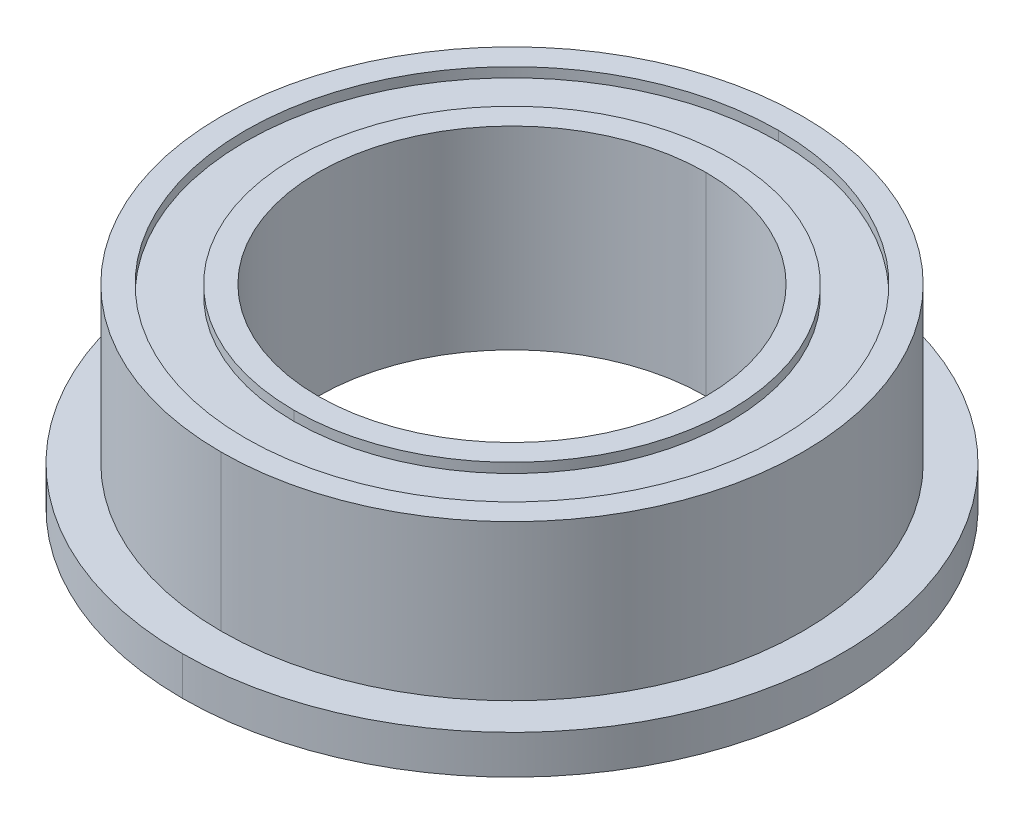
ISO-10303-21;
HEADER;
FILE_DESCRIPTION(('STEP AP214'),'2;1');
FILE_NAME('part.step','',(''),(''),'','','');
FILE_SCHEMA(('AUTOMOTIVE_DESIGN { 1 0 10303 214 1 1 1 1 }'));
ENDSEC;
DATA;
#1=APPLICATION_CONTEXT('core data for automotive mechanical design processes');
#2=APPLICATION_PROTOCOL_DEFINITION('international standard','automotive_design',2000,#1);
#3=PRODUCT_CONTEXT('',#1,'mechanical');
#4=PRODUCT('Part','Part','',(#3));
#5=PRODUCT_RELATED_PRODUCT_CATEGORY('part','',(#4));
#6=PRODUCT_DEFINITION_FORMATION('','',#4);
#7=PRODUCT_DEFINITION_CONTEXT('part definition',#1,'design');
#8=PRODUCT_DEFINITION('design','',#6,#7);
#9=PRODUCT_DEFINITION_SHAPE('','',#8);
#10=(LENGTH_UNIT() NAMED_UNIT(*) SI_UNIT(.MILLI.,.METRE.));
#11=(NAMED_UNIT(*) PLANE_ANGLE_UNIT() SI_UNIT($,.RADIAN.));
#12=(NAMED_UNIT(*) SI_UNIT($,.STERADIAN.) SOLID_ANGLE_UNIT());
#13=UNCERTAINTY_MEASURE_WITH_UNIT(LENGTH_MEASURE(1.E-05),#10,'distance_accuracy_value','');
#14=(GEOMETRIC_REPRESENTATION_CONTEXT(3) GLOBAL_UNCERTAINTY_ASSIGNED_CONTEXT((#13)) GLOBAL_UNIT_ASSIGNED_CONTEXT((#10,
#11,#12)) REPRESENTATION_CONTEXT('',''));
#15=CARTESIAN_POINT('',(0.,0.,0.));
#16=DIRECTION('',(0.,0.,1.));
#17=DIRECTION('',(1.,0.,0.));
#18=AXIS2_PLACEMENT_3D('',#15,#16,#17);
#19=CARTESIAN_POINT('',(0.,0.2,0.));
#20=DIRECTION('',(0.,-1.,0.));
#21=DIRECTION('',(0.,0.,-1.));
#22=AXIS2_PLACEMENT_3D('',#19,#20,#21);
#23=CYLINDRICAL_SURFACE('',#22,4.5);
#24=DIRECTION('',(0.,-1.,0.));
#25=VECTOR('',#24,1.);
#26=CARTESIAN_POINT('',(0.,0.2,4.5));
#27=LINE('',#26,#25);
#28=CARTESIAN_POINT('',(0.,0.2,4.5));
#29=VERTEX_POINT('',#28);
#30=CARTESIAN_POINT('',(0.,0.,4.5));
#31=VERTEX_POINT('',#30);
#32=EDGE_CURVE('E240',#29,#31,#27,.T.);
#33=ORIENTED_EDGE('',*,*,#32,.F.);
#34=CARTESIAN_POINT('',(0.,0.2,0.));
#35=DIRECTION('',(0.,1.,0.));
#36=DIRECTION('',(0.,0.,1.));
#37=AXIS2_PLACEMENT_3D('',#34,#35,#36);
#38=CIRCLE('',#37,4.5);
#39=CARTESIAN_POINT('',(0.,0.2,-4.5));
#40=VERTEX_POINT('',#39);
#41=EDGE_CURVE('E11',#40,#29,#38,.T.);
#42=ORIENTED_EDGE('',*,*,#41,.F.);
#43=DIRECTION('',(0.,-1.,0.));
#44=VECTOR('',#43,1.);
#45=CARTESIAN_POINT('',(0.,0.2,-4.5));
#46=LINE('',#45,#44);
#47=CARTESIAN_POINT('',(0.,0.,-4.5));
#48=VERTEX_POINT('',#47);
#49=EDGE_CURVE('E274',#40,#48,#46,.T.);
#50=ORIENTED_EDGE('',*,*,#49,.T.);
#51=CARTESIAN_POINT('',(0.,0.,0.));
#52=DIRECTION('',(0.,1.,0.));
#53=DIRECTION('',(0.,0.,1.));
#54=AXIS2_PLACEMENT_3D('',#51,#52,#53);
#55=CIRCLE('',#54,4.5);
#56=EDGE_CURVE('E181',#48,#31,#55,.T.);
#57=ORIENTED_EDGE('',*,*,#56,.T.);
#58=EDGE_LOOP('',(#33,#42,#50,#57));
#59=FACE_BOUND('',#58,.T.);
#60=ADVANCED_FACE('F17',(#59),#23,.T.);
#61=CARTESIAN_POINT('',(0.,0.2,0.));
#62=DIRECTION('',(0.,-1.,0.));
#63=DIRECTION('',(0.,0.,-1.));
#64=AXIS2_PLACEMENT_3D('',#61,#62,#63);
#65=CYLINDRICAL_SURFACE('',#64,5.5);
#66=DIRECTION('',(0.,-1.,0.));
#67=VECTOR('',#66,1.);
#68=CARTESIAN_POINT('',(0.,0.2,5.5));
#69=LINE('',#68,#67);
#70=CARTESIAN_POINT('',(0.,0.2,5.5));
#71=VERTEX_POINT('',#70);
#72=CARTESIAN_POINT('',(0.,0.,5.5));
#73=VERTEX_POINT('',#72);
#74=EDGE_CURVE('E248',#71,#73,#69,.T.);
#75=ORIENTED_EDGE('',*,*,#74,.F.);
#76=CARTESIAN_POINT('',(0.,0.2,0.));
#77=DIRECTION('',(0.,1.,0.));
#78=DIRECTION('',(0.,0.,1.));
#79=AXIS2_PLACEMENT_3D('',#76,#77,#78);
#80=CIRCLE('',#79,5.5);
#81=CARTESIAN_POINT('',(0.,0.2,-5.5));
#82=VERTEX_POINT('',#81);
#83=EDGE_CURVE('E28',#71,#82,#80,.T.);
#84=ORIENTED_EDGE('',*,*,#83,.T.);
#85=DIRECTION('',(0.,-1.,0.));
#86=VECTOR('',#85,1.);
#87=CARTESIAN_POINT('',(0.,0.2,-5.5));
#88=LINE('',#87,#86);
#89=CARTESIAN_POINT('',(0.,0.,-5.5));
#90=VERTEX_POINT('',#89);
#91=EDGE_CURVE('E208',#82,#90,#88,.T.);
#92=ORIENTED_EDGE('',*,*,#91,.T.);
#93=CARTESIAN_POINT('',(0.,0.,0.));
#94=DIRECTION('',(0.,1.,0.));
#95=DIRECTION('',(0.,0.,1.));
#96=AXIS2_PLACEMENT_3D('',#93,#94,#95);
#97=CIRCLE('',#96,5.5);
#98=EDGE_CURVE('E207',#73,#90,#97,.T.);
#99=ORIENTED_EDGE('',*,*,#98,.F.);
#100=EDGE_LOOP('',(#75,#84,#92,#99));
#101=FACE_BOUND('',#100,.T.);
#102=ADVANCED_FACE('F352',(#101),#65,.F.);
#103=CARTESIAN_POINT('',(0.,0.2,0.));
#104=DIRECTION('',(0.,-1.,0.));
#105=DIRECTION('',(0.,0.,-1.));
#106=AXIS2_PLACEMENT_3D('',#103,#104,#105);
#107=PLANE('',#106);
#108=ORIENTED_EDGE('',*,*,#41,.T.);
#109=CARTESIAN_POINT('',(0.,0.2,0.));
#110=DIRECTION('',(0.,1.,0.));
#111=DIRECTION('',(0.,0.,1.));
#112=AXIS2_PLACEMENT_3D('',#109,#110,#111);
#113=CIRCLE('',#112,4.5);
#114=EDGE_CURVE('E236',#29,#40,#113,.T.);
#115=ORIENTED_EDGE('',*,*,#114,.T.);
#116=EDGE_LOOP('',(#108,#115));
#117=FACE_BOUND('',#116,.T.);
#118=CARTESIAN_POINT('',(0.,0.2,0.));
#119=DIRECTION('',(0.,1.,0.));
#120=DIRECTION('',(0.,0.,1.));
#121=AXIS2_PLACEMENT_3D('',#118,#119,#120);
#122=CIRCLE('',#121,5.5);
#123=EDGE_CURVE('E316',#82,#71,#122,.T.);
#124=ORIENTED_EDGE('',*,*,#123,.F.);
#125=ORIENTED_EDGE('',*,*,#83,.F.);
#126=EDGE_LOOP('',(#124,#125));
#127=FACE_BOUND('',#126,.T.);
#128=ADVANCED_FACE('F379',(#117,#127),#107,.T.);
#129=CARTESIAN_POINT('',(0.,3.8,0.));
#130=DIRECTION('',(0.,1.,0.));
#131=DIRECTION('',(0.,0.,1.));
#132=AXIS2_PLACEMENT_3D('',#129,#130,#131);
#133=CYLINDRICAL_SURFACE('',#132,4.5);
#134=DIRECTION('',(0.,1.,0.));
#135=VECTOR('',#134,1.);
#136=CARTESIAN_POINT('',(0.,3.8,-4.5));
#137=LINE('',#136,#135);
#138=CARTESIAN_POINT('',(0.,3.8,-4.5));
#139=VERTEX_POINT('',#138);
#140=CARTESIAN_POINT('',(0.,4.,-4.5));
#141=VERTEX_POINT('',#140);
#142=EDGE_CURVE('E219',#139,#141,#137,.T.);
#143=ORIENTED_EDGE('',*,*,#142,.F.);
#144=CARTESIAN_POINT('',(0.,3.8,0.));
#145=DIRECTION('',(0.,1.,0.));
#146=DIRECTION('',(0.,0.,1.));
#147=AXIS2_PLACEMENT_3D('',#144,#145,#146);
#148=CIRCLE('',#147,4.5);
#149=CARTESIAN_POINT('',(0.,3.8,4.5));
#150=VERTEX_POINT('',#149);
#151=EDGE_CURVE('E113',#139,#150,#148,.T.);
#152=ORIENTED_EDGE('',*,*,#151,.T.);
#153=DIRECTION('',(0.,1.,0.));
#154=VECTOR('',#153,1.);
#155=CARTESIAN_POINT('',(0.,3.8,4.5));
#156=LINE('',#155,#154);
#157=CARTESIAN_POINT('',(0.,4.,4.5));
#158=VERTEX_POINT('',#157);
#159=EDGE_CURVE('E214',#150,#158,#156,.T.);
#160=ORIENTED_EDGE('',*,*,#159,.T.);
#161=CARTESIAN_POINT('',(0.,4.,0.));
#162=DIRECTION('',(0.,1.,0.));
#163=DIRECTION('',(0.,0.,1.));
#164=AXIS2_PLACEMENT_3D('',#161,#162,#163);
#165=CIRCLE('',#164,4.5);
#166=EDGE_CURVE('E99',#141,#158,#165,.T.);
#167=ORIENTED_EDGE('',*,*,#166,.F.);
#168=EDGE_LOOP('',(#143,#152,#160,#167));
#169=FACE_BOUND('',#168,.T.);
#170=ADVANCED_FACE('F436',(#169),#133,.T.);
#171=CARTESIAN_POINT('',(0.,3.8,0.));
#172=DIRECTION('',(0.,1.,0.));
#173=DIRECTION('',(1.,0.,0.));
#174=AXIS2_PLACEMENT_3D('',#171,#172,#173);
#175=PLANE('',#174);
#176=CARTESIAN_POINT('',(0.,3.8,0.));
#177=DIRECTION('',(0.,1.,0.));
#178=DIRECTION('',(0.,0.,1.));
#179=AXIS2_PLACEMENT_3D('',#176,#177,#178);
#180=CIRCLE('',#179,4.5);
#181=EDGE_CURVE('E212',#150,#139,#180,.T.);
#182=ORIENTED_EDGE('',*,*,#181,.F.);
#183=ORIENTED_EDGE('',*,*,#151,.F.);
#184=EDGE_LOOP('',(#182,#183));
#185=FACE_BOUND('',#184,.T.);
#186=CARTESIAN_POINT('',(0.,3.8,0.));
#187=DIRECTION('',(0.,1.,0.));
#188=DIRECTION('',(0.,0.,1.));
#189=AXIS2_PLACEMENT_3D('',#186,#187,#188);
#190=CIRCLE('',#189,5.5);
#191=CARTESIAN_POINT('',(0.,3.8,5.5));
#192=VERTEX_POINT('',#191);
#193=CARTESIAN_POINT('',(0.,3.8,-5.5));
#194=VERTEX_POINT('',#193);
#195=EDGE_CURVE('E270',#192,#194,#190,.T.);
#196=ORIENTED_EDGE('',*,*,#195,.T.);
#197=CARTESIAN_POINT('',(0.,3.8,0.));
#198=DIRECTION('',(0.,1.,0.));
#199=DIRECTION('',(0.,0.,1.));
#200=AXIS2_PLACEMENT_3D('',#197,#198,#199);
#201=CIRCLE('',#200,5.5);
#202=EDGE_CURVE('E217',#194,#192,#201,.T.);
#203=ORIENTED_EDGE('',*,*,#202,.T.);
#204=EDGE_LOOP('',(#196,#203));
#205=FACE_BOUND('',#204,.T.);
#206=ADVANCED_FACE('F330',(#185,#205),#175,.T.);
#207=CARTESIAN_POINT('',(0.,3.8,0.));
#208=DIRECTION('',(0.,1.,0.));
#209=DIRECTION('',(0.,0.,1.));
#210=AXIS2_PLACEMENT_3D('',#207,#208,#209);
#211=CYLINDRICAL_SURFACE('',#210,5.5);
#212=DIRECTION('',(0.,1.,0.));
#213=VECTOR('',#212,1.);
#214=CARTESIAN_POINT('',(0.,3.8,-5.5));
#215=LINE('',#214,#213);
#216=CARTESIAN_POINT('',(0.,4.,-5.5));
#217=VERTEX_POINT('',#216);
#218=EDGE_CURVE('E203',#194,#217,#215,.T.);
#219=ORIENTED_EDGE('',*,*,#218,.F.);
#220=ORIENTED_EDGE('',*,*,#195,.F.);
#221=DIRECTION('',(0.,1.,0.));
#222=VECTOR('',#221,1.);
#223=CARTESIAN_POINT('',(0.,3.8,5.5));
#224=LINE('',#223,#222);
#225=CARTESIAN_POINT('',(0.,4.,5.5));
#226=VERTEX_POINT('',#225);
#227=EDGE_CURVE('E202',#192,#226,#224,.T.);
#228=ORIENTED_EDGE('',*,*,#227,.T.);
#229=CARTESIAN_POINT('',(0.,4.,0.));
#230=DIRECTION('',(0.,1.,0.));
#231=DIRECTION('',(0.,0.,1.));
#232=AXIS2_PLACEMENT_3D('',#229,#230,#231);
#233=CIRCLE('',#232,5.5);
#234=EDGE_CURVE('E174',#226,#217,#233,.T.);
#235=ORIENTED_EDGE('',*,*,#234,.T.);
#236=EDGE_LOOP('',(#219,#220,#228,#235));
#237=FACE_BOUND('',#236,.T.);
#238=ADVANCED_FACE('F323',(#237),#211,.F.);
#239=CARTESIAN_POINT('',(0.,0.8,0.));
#240=DIRECTION('',(0.,-1.,0.));
#241=DIRECTION('',(0.,0.,-1.));
#242=AXIS2_PLACEMENT_3D('',#239,#240,#241);
#243=CYLINDRICAL_SURFACE('',#242,6.8);
#244=DIRECTION('',(0.,-1.,0.));
#245=VECTOR('',#244,1.);
#246=CARTESIAN_POINT('',(0.,0.8,6.8));
#247=LINE('',#246,#245);
#248=CARTESIAN_POINT('',(0.,0.8,6.8));
#249=VERTEX_POINT('',#248);
#250=CARTESIAN_POINT('',(0.,0.,6.8));
#251=VERTEX_POINT('',#250);
#252=EDGE_CURVE('E259',#249,#251,#247,.T.);
#253=ORIENTED_EDGE('',*,*,#252,.F.);
#254=CARTESIAN_POINT('',(0.,0.8,0.));
#255=DIRECTION('',(0.,1.,0.));
#256=DIRECTION('',(0.,0.,1.));
#257=AXIS2_PLACEMENT_3D('',#254,#255,#256);
#258=CIRCLE('',#257,6.8);
#259=CARTESIAN_POINT('',(0.,0.8,-6.8));
#260=VERTEX_POINT('',#259);
#261=EDGE_CURVE('E267',#260,#249,#258,.T.);
#262=ORIENTED_EDGE('',*,*,#261,.F.);
#263=DIRECTION('',(0.,-1.,0.));
#264=VECTOR('',#263,1.);
#265=CARTESIAN_POINT('',(0.,0.8,-6.8));
#266=LINE('',#265,#264);
#267=CARTESIAN_POINT('',(0.,0.,-6.8));
#268=VERTEX_POINT('',#267);
#269=EDGE_CURVE('E228',#260,#268,#266,.T.);
#270=ORIENTED_EDGE('',*,*,#269,.T.);
#271=CARTESIAN_POINT('',(0.,0.,0.));
#272=DIRECTION('',(0.,1.,0.));
#273=DIRECTION('',(0.,0.,1.));
#274=AXIS2_PLACEMENT_3D('',#271,#272,#273);
#275=CIRCLE('',#274,6.8);
#276=EDGE_CURVE('E204',#268,#251,#275,.T.);
#277=ORIENTED_EDGE('',*,*,#276,.T.);
#278=EDGE_LOOP('',(#253,#262,#270,#277));
#279=FACE_BOUND('',#278,.T.);
#280=ADVANCED_FACE('F359',(#279),#243,.T.);
#281=CARTESIAN_POINT('',(0.,0.8,0.));
#282=DIRECTION('',(0.,1.,0.));
#283=DIRECTION('',(1.,0.,0.));
#284=AXIS2_PLACEMENT_3D('',#281,#282,#283);
#285=PLANE('',#284);
#286=CARTESIAN_POINT('',(0.,0.8,0.));
#287=DIRECTION('',(0.,1.,0.));
#288=DIRECTION('',(0.,0.,1.));
#289=AXIS2_PLACEMENT_3D('',#286,#287,#288);
#290=CIRCLE('',#289,6.);
#291=CARTESIAN_POINT('',(0.,0.8,-6.));
#292=VERTEX_POINT('',#291);
#293=CARTESIAN_POINT('',(0.,0.8,6.));
#294=VERTEX_POINT('',#293);
#295=EDGE_CURVE('E21',#292,#294,#290,.T.);
#296=ORIENTED_EDGE('',*,*,#295,.F.);
#297=CARTESIAN_POINT('',(0.,0.8,0.));
#298=DIRECTION('',(0.,1.,0.));
#299=DIRECTION('',(0.,0.,1.));
#300=AXIS2_PLACEMENT_3D('',#297,#298,#299);
#301=CIRCLE('',#300,6.);
#302=EDGE_CURVE('E179',#294,#292,#301,.T.);
#303=ORIENTED_EDGE('',*,*,#302,.F.);
#304=EDGE_LOOP('',(#296,#303));
#305=FACE_BOUND('',#304,.T.);
#306=ORIENTED_EDGE('',*,*,#261,.T.);
#307=CARTESIAN_POINT('',(0.,0.8,0.));
#308=DIRECTION('',(0.,1.,0.));
#309=DIRECTION('',(0.,0.,1.));
#310=AXIS2_PLACEMENT_3D('',#307,#308,#309);
#311=CIRCLE('',#310,6.8);
#312=EDGE_CURVE('E251',#249,#260,#311,.T.);
#313=ORIENTED_EDGE('',*,*,#312,.T.);
#314=EDGE_LOOP('',(#306,#313));
#315=FACE_BOUND('',#314,.T.);
#316=ADVANCED_FACE('F362',(#305,#315),#285,.T.);
#317=CARTESIAN_POINT('',(0.,4.,0.));
#318=DIRECTION('',(0.,-1.,0.));
#319=DIRECTION('',(0.,0.,-1.));
#320=AXIS2_PLACEMENT_3D('',#317,#318,#319);
#321=CYLINDRICAL_SURFACE('',#320,4.);
#322=DIRECTION('',(0.,-1.,0.));
#323=VECTOR('',#322,1.);
#324=CARTESIAN_POINT('',(0.,4.,4.));
#325=LINE('',#324,#323);
#326=CARTESIAN_POINT('',(0.,4.,4.));
#327=VERTEX_POINT('',#326);
#328=CARTESIAN_POINT('',(0.,0.,4.));
#329=VERTEX_POINT('',#328);
#330=EDGE_CURVE('E227',#327,#329,#325,.T.);
#331=ORIENTED_EDGE('',*,*,#330,.F.);
#332=CARTESIAN_POINT('',(0.,4.,0.));
#333=DIRECTION('',(0.,1.,0.));
#334=DIRECTION('',(0.,0.,1.));
#335=AXIS2_PLACEMENT_3D('',#332,#333,#334);
#336=CIRCLE('',#335,4.);
#337=CARTESIAN_POINT('',(0.,4.,-4.));
#338=VERTEX_POINT('',#337);
#339=EDGE_CURVE('E175',#327,#338,#336,.T.);
#340=ORIENTED_EDGE('',*,*,#339,.T.);
#341=DIRECTION('',(0.,-1.,0.));
#342=VECTOR('',#341,1.);
#343=CARTESIAN_POINT('',(0.,4.,-4.));
#344=LINE('',#343,#342);
#345=CARTESIAN_POINT('',(0.,0.,-4.));
#346=VERTEX_POINT('',#345);
#347=EDGE_CURVE('E185',#338,#346,#344,.T.);
#348=ORIENTED_EDGE('',*,*,#347,.T.);
#349=CARTESIAN_POINT('',(0.,0.,0.));
#350=DIRECTION('',(0.,1.,0.));
#351=DIRECTION('',(0.,0.,1.));
#352=AXIS2_PLACEMENT_3D('',#349,#350,#351);
#353=CIRCLE('',#352,4.);
#354=EDGE_CURVE('E233',#329,#346,#353,.T.);
#355=ORIENTED_EDGE('',*,*,#354,.F.);
#356=EDGE_LOOP('',(#331,#340,#348,#355));
#357=FACE_BOUND('',#356,.T.);
#358=ADVANCED_FACE('F364',(#357),#321,.F.);
#359=CARTESIAN_POINT('',(0.,4.,0.));
#360=DIRECTION('',(0.,-1.,0.));
#361=DIRECTION('',(0.,0.,-1.));
#362=AXIS2_PLACEMENT_3D('',#359,#360,#361);
#363=CYLINDRICAL_SURFACE('',#362,6.);
#364=DIRECTION('',(0.,-1.,0.));
#365=VECTOR('',#364,1.);
#366=CARTESIAN_POINT('',(0.,4.,6.));
#367=LINE('',#366,#365);
#368=CARTESIAN_POINT('',(0.,4.,6.));
#369=VERTEX_POINT('',#368);
#370=EDGE_CURVE('E169',#369,#294,#367,.T.);
#371=ORIENTED_EDGE('',*,*,#370,.F.);
#372=CARTESIAN_POINT('',(0.,4.,0.));
#373=DIRECTION('',(0.,1.,0.));
#374=DIRECTION('',(0.,0.,1.));
#375=AXIS2_PLACEMENT_3D('',#372,#373,#374);
#376=CIRCLE('',#375,6.);
#377=CARTESIAN_POINT('',(0.,4.,-6.));
#378=VERTEX_POINT('',#377);
#379=EDGE_CURVE('E163',#378,#369,#376,.T.);
#380=ORIENTED_EDGE('',*,*,#379,.F.);
#381=DIRECTION('',(0.,-1.,0.));
#382=VECTOR('',#381,1.);
#383=CARTESIAN_POINT('',(0.,4.,-6.));
#384=LINE('',#383,#382);
#385=EDGE_CURVE('E166',#378,#292,#384,.T.);
#386=ORIENTED_EDGE('',*,*,#385,.T.);
#387=ORIENTED_EDGE('',*,*,#295,.T.);
#388=EDGE_LOOP('',(#371,#380,#386,#387));
#389=FACE_BOUND('',#388,.T.);
#390=ADVANCED_FACE('F165',(#389),#363,.T.);
#391=CARTESIAN_POINT('',(0.,0.,0.));
#392=DIRECTION('',(0.,1.,0.));
#393=DIRECTION('',(1.,0.,0.));
#394=AXIS2_PLACEMENT_3D('',#391,#392,#393);
#395=PLANE('',#394);
#396=CARTESIAN_POINT('',(0.,0.,0.));
#397=DIRECTION('',(0.,1.,0.));
#398=DIRECTION('',(0.,0.,1.));
#399=AXIS2_PLACEMENT_3D('',#396,#397,#398);
#400=CIRCLE('',#399,5.5);
#401=EDGE_CURVE('E213',#90,#73,#400,.T.);
#402=ORIENTED_EDGE('',*,*,#401,.T.);
#403=ORIENTED_EDGE('',*,*,#98,.T.);
#404=EDGE_LOOP('',(#402,#403));
#405=FACE_BOUND('',#404,.T.);
#406=ORIENTED_EDGE('',*,*,#276,.F.);
#407=CARTESIAN_POINT('',(0.,0.,0.));
#408=DIRECTION('',(0.,1.,0.));
#409=DIRECTION('',(0.,0.,1.));
#410=AXIS2_PLACEMENT_3D('',#407,#408,#409);
#411=CIRCLE('',#410,6.8);
#412=EDGE_CURVE('E279',#251,#268,#411,.T.);
#413=ORIENTED_EDGE('',*,*,#412,.F.);
#414=EDGE_LOOP('',(#406,#413));
#415=FACE_BOUND('',#414,.T.);
#416=ADVANCED_FACE('F354',(#405,#415),#395,.F.);
#417=CARTESIAN_POINT('',(0.,4.,0.));
#418=DIRECTION('',(0.,1.,0.));
#419=DIRECTION('',(1.,0.,0.));
#420=AXIS2_PLACEMENT_3D('',#417,#418,#419);
#421=PLANE('',#420);
#422=ORIENTED_EDGE('',*,*,#234,.F.);
#423=CARTESIAN_POINT('',(0.,4.,0.));
#424=DIRECTION('',(0.,1.,0.));
#425=DIRECTION('',(0.,0.,1.));
#426=AXIS2_PLACEMENT_3D('',#423,#424,#425);
#427=CIRCLE('',#426,5.5);
#428=EDGE_CURVE('E198',#217,#226,#427,.T.);
#429=ORIENTED_EDGE('',*,*,#428,.F.);
#430=EDGE_LOOP('',(#422,#429));
#431=FACE_BOUND('',#430,.T.);
#432=ORIENTED_EDGE('',*,*,#379,.T.);
#433=CARTESIAN_POINT('',(0.,4.,0.));
#434=DIRECTION('',(0.,1.,0.));
#435=DIRECTION('',(0.,0.,1.));
#436=AXIS2_PLACEMENT_3D('',#433,#434,#435);
#437=CIRCLE('',#436,6.);
#438=EDGE_CURVE('E178',#369,#378,#437,.T.);
#439=ORIENTED_EDGE('',*,*,#438,.T.);
#440=EDGE_LOOP('',(#432,#439));
#441=FACE_BOUND('',#440,.T.);
#442=ADVANCED_FACE('F183',(#431,#441),#421,.T.);
#443=CARTESIAN_POINT('',(0.,4.,0.));
#444=DIRECTION('',(0.,1.,0.));
#445=DIRECTION('',(1.,0.,0.));
#446=AXIS2_PLACEMENT_3D('',#443,#444,#445);
#447=PLANE('',#446);
#448=CARTESIAN_POINT('',(0.,4.,0.));
#449=DIRECTION('',(0.,1.,0.));
#450=DIRECTION('',(0.,0.,1.));
#451=AXIS2_PLACEMENT_3D('',#448,#449,#450);
#452=CIRCLE('',#451,4.);
#453=EDGE_CURVE('E223',#338,#327,#452,.T.);
#454=ORIENTED_EDGE('',*,*,#453,.F.);
#455=ORIENTED_EDGE('',*,*,#339,.F.);
#456=EDGE_LOOP('',(#454,#455));
#457=FACE_BOUND('',#456,.T.);
#458=CARTESIAN_POINT('',(0.,4.,0.));
#459=DIRECTION('',(0.,1.,0.));
#460=DIRECTION('',(0.,0.,1.));
#461=AXIS2_PLACEMENT_3D('',#458,#459,#460);
#462=CIRCLE('',#461,4.5);
#463=EDGE_CURVE('E218',#158,#141,#462,.T.);
#464=ORIENTED_EDGE('',*,*,#463,.T.);
#465=ORIENTED_EDGE('',*,*,#166,.T.);
#466=EDGE_LOOP('',(#464,#465));
#467=FACE_BOUND('',#466,.T.);
#468=ADVANCED_FACE('F405',(#457,#467),#447,.T.);
#469=CARTESIAN_POINT('',(0.,0.,0.));
#470=DIRECTION('',(0.,1.,0.));
#471=DIRECTION('',(1.,0.,0.));
#472=AXIS2_PLACEMENT_3D('',#469,#470,#471);
#473=PLANE('',#472);
#474=CARTESIAN_POINT('',(0.,0.,0.));
#475=DIRECTION('',(0.,1.,0.));
#476=DIRECTION('',(0.,0.,1.));
#477=AXIS2_PLACEMENT_3D('',#474,#475,#476);
#478=CIRCLE('',#477,4.);
#479=EDGE_CURVE('E194',#346,#329,#478,.T.);
#480=ORIENTED_EDGE('',*,*,#479,.T.);
#481=ORIENTED_EDGE('',*,*,#354,.T.);
#482=EDGE_LOOP('',(#480,#481));
#483=FACE_BOUND('',#482,.T.);
#484=ORIENTED_EDGE('',*,*,#56,.F.);
#485=CARTESIAN_POINT('',(0.,0.,0.));
#486=DIRECTION('',(0.,1.,0.));
#487=DIRECTION('',(0.,0.,1.));
#488=AXIS2_PLACEMENT_3D('',#485,#486,#487);
#489=CIRCLE('',#488,4.5);
#490=EDGE_CURVE('E244',#31,#48,#489,.T.);
#491=ORIENTED_EDGE('',*,*,#490,.F.);
#492=EDGE_LOOP('',(#484,#491));
#493=FACE_BOUND('',#492,.T.);
#494=ADVANCED_FACE('F402',(#483,#493),#473,.F.);
#495=CARTESIAN_POINT('',(0.,4.,0.));
#496=DIRECTION('',(0.,-1.,0.));
#497=DIRECTION('',(0.,0.,-1.));
#498=AXIS2_PLACEMENT_3D('',#495,#496,#497);
#499=CYLINDRICAL_SURFACE('',#498,6.);
#500=ORIENTED_EDGE('',*,*,#438,.F.);
#501=ORIENTED_EDGE('',*,*,#370,.T.);
#502=ORIENTED_EDGE('',*,*,#302,.T.);
#503=ORIENTED_EDGE('',*,*,#385,.F.);
#504=EDGE_LOOP('',(#500,#501,#502,#503));
#505=FACE_BOUND('',#504,.T.);
#506=ADVANCED_FACE('F19',(#505),#499,.T.);
#507=CARTESIAN_POINT('',(0.,4.,0.));
#508=DIRECTION('',(0.,-1.,0.));
#509=DIRECTION('',(0.,0.,-1.));
#510=AXIS2_PLACEMENT_3D('',#507,#508,#509);
#511=CYLINDRICAL_SURFACE('',#510,4.);
#512=ORIENTED_EDGE('',*,*,#453,.T.);
#513=ORIENTED_EDGE('',*,*,#330,.T.);
#514=ORIENTED_EDGE('',*,*,#479,.F.);
#515=ORIENTED_EDGE('',*,*,#347,.F.);
#516=EDGE_LOOP('',(#512,#513,#514,#515));
#517=FACE_BOUND('',#516,.T.);
#518=ADVANCED_FACE('F411',(#517),#511,.F.);
#519=CARTESIAN_POINT('',(0.,0.8,0.));
#520=DIRECTION('',(0.,-1.,0.));
#521=DIRECTION('',(0.,0.,-1.));
#522=AXIS2_PLACEMENT_3D('',#519,#520,#521);
#523=CYLINDRICAL_SURFACE('',#522,6.8);
#524=ORIENTED_EDGE('',*,*,#312,.F.);
#525=ORIENTED_EDGE('',*,*,#252,.T.);
#526=ORIENTED_EDGE('',*,*,#412,.T.);
#527=ORIENTED_EDGE('',*,*,#269,.F.);
#528=EDGE_LOOP('',(#524,#525,#526,#527));
#529=FACE_BOUND('',#528,.T.);
#530=ADVANCED_FACE('F360',(#529),#523,.T.);
#531=CARTESIAN_POINT('',(0.,3.8,0.));
#532=DIRECTION('',(0.,1.,0.));
#533=DIRECTION('',(0.,0.,1.));
#534=AXIS2_PLACEMENT_3D('',#531,#532,#533);
#535=CYLINDRICAL_SURFACE('',#534,5.5);
#536=ORIENTED_EDGE('',*,*,#202,.F.);
#537=ORIENTED_EDGE('',*,*,#218,.T.);
#538=ORIENTED_EDGE('',*,*,#428,.T.);
#539=ORIENTED_EDGE('',*,*,#227,.F.);
#540=EDGE_LOOP('',(#536,#537,#538,#539));
#541=FACE_BOUND('',#540,.T.);
#542=ADVANCED_FACE('F328',(#541),#535,.F.);
#543=CARTESIAN_POINT('',(0.,3.8,0.));
#544=DIRECTION('',(0.,1.,0.));
#545=DIRECTION('',(0.,0.,1.));
#546=AXIS2_PLACEMENT_3D('',#543,#544,#545);
#547=CYLINDRICAL_SURFACE('',#546,4.5);
#548=ORIENTED_EDGE('',*,*,#181,.T.);
#549=ORIENTED_EDGE('',*,*,#142,.T.);
#550=ORIENTED_EDGE('',*,*,#463,.F.);
#551=ORIENTED_EDGE('',*,*,#159,.F.);
#552=EDGE_LOOP('',(#548,#549,#550,#551));
#553=FACE_BOUND('',#552,.T.);
#554=ADVANCED_FACE('F383',(#553),#547,.T.);
#555=CARTESIAN_POINT('',(0.,0.2,0.));
#556=DIRECTION('',(0.,-1.,0.));
#557=DIRECTION('',(0.,0.,-1.));
#558=AXIS2_PLACEMENT_3D('',#555,#556,#557);
#559=CYLINDRICAL_SURFACE('',#558,5.5);
#560=ORIENTED_EDGE('',*,*,#123,.T.);
#561=ORIENTED_EDGE('',*,*,#74,.T.);
#562=ORIENTED_EDGE('',*,*,#401,.F.);
#563=ORIENTED_EDGE('',*,*,#91,.F.);
#564=EDGE_LOOP('',(#560,#561,#562,#563));
#565=FACE_BOUND('',#564,.T.);
#566=ADVANCED_FACE('F350',(#565),#559,.F.);
#567=CARTESIAN_POINT('',(0.,0.2,0.));
#568=DIRECTION('',(0.,-1.,0.));
#569=DIRECTION('',(0.,0.,-1.));
#570=AXIS2_PLACEMENT_3D('',#567,#568,#569);
#571=CYLINDRICAL_SURFACE('',#570,4.5);
#572=ORIENTED_EDGE('',*,*,#114,.F.);
#573=ORIENTED_EDGE('',*,*,#32,.T.);
#574=ORIENTED_EDGE('',*,*,#490,.T.);
#575=ORIENTED_EDGE('',*,*,#49,.F.);
#576=EDGE_LOOP('',(#572,#573,#574,#575));
#577=FACE_BOUND('',#576,.T.);
#578=ADVANCED_FACE('F389',(#577),#571,.T.);
#579=CLOSED_SHELL('',(#60,#102,#128,#170,#206,#238,#280,#316,#358,#390,#416,#442,#468,#494,#506,
#518,#530,#542,#554,#566,#578));
#580=MANIFOLD_SOLID_BREP('B1',#579);
#581=ADVANCED_BREP_SHAPE_REPRESENTATION('',(#18,#580),#14);
#582=SHAPE_DEFINITION_REPRESENTATION(#9,#581);
ENDSEC;
END-ISO-10303-21;
